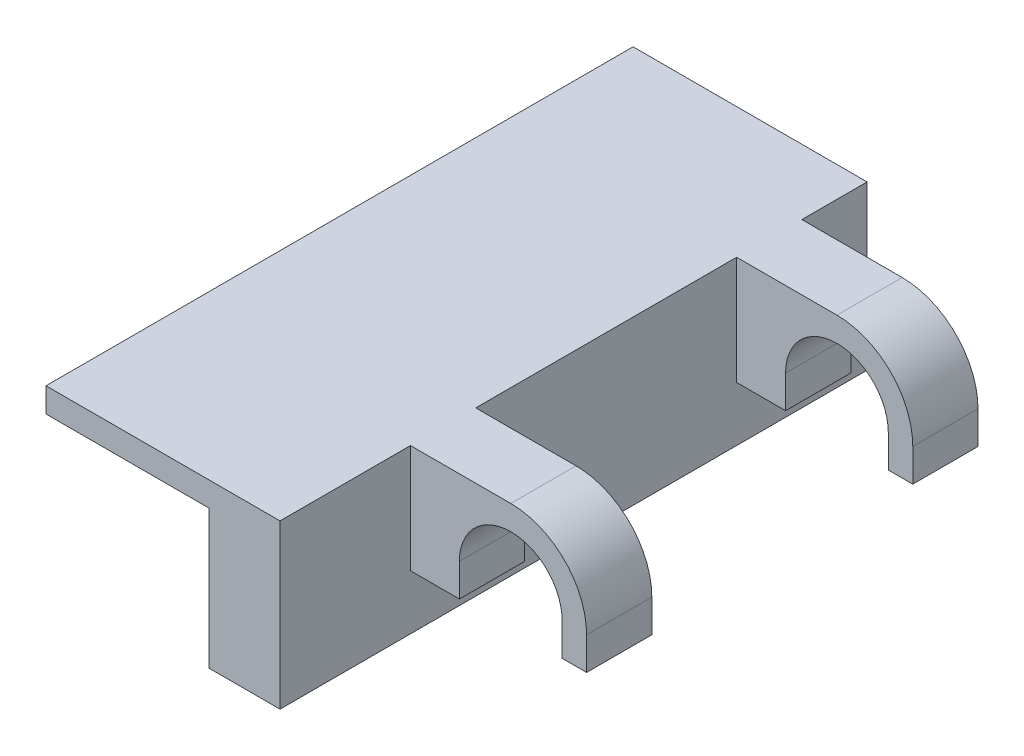
ISO-10303-21;
HEADER;
FILE_DESCRIPTION(('STEP AP214'),'2;1');
FILE_NAME('part.step','',(''),(''),'','','');
FILE_SCHEMA(('AUTOMOTIVE_DESIGN { 1 0 10303 214 1 1 1 1 }'));
ENDSEC;
DATA;
#1=APPLICATION_CONTEXT('core data for automotive mechanical design processes');
#2=APPLICATION_PROTOCOL_DEFINITION('international standard','automotive_design',2000,#1);
#3=PRODUCT_CONTEXT('',#1,'mechanical');
#4=PRODUCT('Part','Part','',(#3));
#5=PRODUCT_RELATED_PRODUCT_CATEGORY('part','',(#4));
#6=PRODUCT_DEFINITION_FORMATION('','',#4);
#7=PRODUCT_DEFINITION_CONTEXT('part definition',#1,'design');
#8=PRODUCT_DEFINITION('design','',#6,#7);
#9=PRODUCT_DEFINITION_SHAPE('','',#8);
#10=(LENGTH_UNIT() NAMED_UNIT(*) SI_UNIT(.MILLI.,.METRE.));
#11=(NAMED_UNIT(*) PLANE_ANGLE_UNIT() SI_UNIT($,.RADIAN.));
#12=(NAMED_UNIT(*) SI_UNIT($,.STERADIAN.) SOLID_ANGLE_UNIT());
#13=UNCERTAINTY_MEASURE_WITH_UNIT(LENGTH_MEASURE(1.E-05),#10,'distance_accuracy_value','');
#14=(GEOMETRIC_REPRESENTATION_CONTEXT(3) GLOBAL_UNCERTAINTY_ASSIGNED_CONTEXT((#13)) GLOBAL_UNIT_ASSIGNED_CONTEXT((#10,
#11,#12)) REPRESENTATION_CONTEXT('',''));
#15=CARTESIAN_POINT('',(0.,0.,0.));
#16=DIRECTION('',(0.,0.,1.));
#17=DIRECTION('',(1.,0.,0.));
#18=AXIS2_PLACEMENT_3D('',#15,#16,#17);
#19=CARTESIAN_POINT('',(191.85,-2.,18.));
#20=DIRECTION('',(0.,1.,0.));
#21=DIRECTION('',(-1.,0.,0.));
#22=AXIS2_PLACEMENT_3D('',#19,#20,#21);
#23=PLANE('',#22);
#24=DIRECTION('',(0.,0.,-1.));
#25=VECTOR('',#24,1.);
#26=CARTESIAN_POINT('',(191.85,-2.,18.));
#27=LINE('',#26,#25);
#28=CARTESIAN_POINT('',(191.85,-2.,10.));
#29=VERTEX_POINT('',#28);
#30=CARTESIAN_POINT('',(191.85,-2.,6.));
#31=VERTEX_POINT('',#30);
#32=EDGE_CURVE('E259',#29,#31,#27,.T.);
#33=ORIENTED_EDGE('',*,*,#32,.F.);
#34=DIRECTION('',(-1.,0.,0.));
#35=VECTOR('',#34,1.);
#36=CARTESIAN_POINT('',(191.85,-2.,10.));
#37=LINE('',#36,#35);
#38=CARTESIAN_POINT('',(188.85,-1.99999999999997,10.));
#39=VERTEX_POINT('',#38);
#40=EDGE_CURVE('E219',#29,#39,#37,.T.);
#41=ORIENTED_EDGE('',*,*,#40,.T.);
#42=DIRECTION('',(0.,0.,-1.));
#43=VECTOR('',#42,1.);
#44=CARTESIAN_POINT('',(188.85,-1.99999999999995,18.));
#45=LINE('',#44,#43);
#46=CARTESIAN_POINT('',(188.85,-1.99999999999997,6.));
#47=VERTEX_POINT('',#46);
#48=EDGE_CURVE('E262',#39,#47,#45,.T.);
#49=ORIENTED_EDGE('',*,*,#48,.T.);
#50=DIRECTION('',(1.,0.,0.));
#51=VECTOR('',#50,1.);
#52=CARTESIAN_POINT('',(191.85,-2.,6.));
#53=LINE('',#52,#51);
#54=EDGE_CURVE('E270',#47,#31,#53,.T.);
#55=ORIENTED_EDGE('',*,*,#54,.T.);
#56=EDGE_LOOP('',(#33,#41,#49,#55));
#57=FACE_BOUND('',#56,.T.);
#58=ADVANCED_FACE('F35',(#57),#23,.F.);
#59=CARTESIAN_POINT('',(191.85,0.,18.));
#60=DIRECTION('',(-1.,0.,0.));
#61=DIRECTION('',(0.,0.,1.));
#62=AXIS2_PLACEMENT_3D('',#59,#60,#61);
#63=PLANE('',#62);
#64=DIRECTION('',(0.,0.,-1.));
#65=VECTOR('',#64,1.);
#66=CARTESIAN_POINT('',(191.85,0.,18.));
#67=LINE('',#66,#65);
#68=CARTESIAN_POINT('',(191.85,0.,10.));
#69=VERTEX_POINT('',#68);
#70=CARTESIAN_POINT('',(191.85,0.,6.));
#71=VERTEX_POINT('',#70);
#72=EDGE_CURVE('E255',#69,#71,#67,.T.);
#73=ORIENTED_EDGE('',*,*,#72,.F.);
#74=DIRECTION('',(0.,-1.,0.));
#75=VECTOR('',#74,1.);
#76=CARTESIAN_POINT('',(191.85,0.,10.));
#77=LINE('',#76,#75);
#78=EDGE_CURVE('E224',#69,#29,#77,.T.);
#79=ORIENTED_EDGE('',*,*,#78,.T.);
#80=ORIENTED_EDGE('',*,*,#32,.T.);
#81=DIRECTION('',(0.,1.,0.));
#82=VECTOR('',#81,1.);
#83=CARTESIAN_POINT('',(191.85,0.,6.));
#84=LINE('',#83,#82);
#85=EDGE_CURVE('E346',#31,#71,#84,.T.);
#86=ORIENTED_EDGE('',*,*,#85,.T.);
#87=EDGE_LOOP('',(#73,#79,#80,#86));
#88=FACE_BOUND('',#87,.T.);
#89=ADVANCED_FACE('F443',(#88),#63,.F.);
#90=CARTESIAN_POINT('',(195.,0.,18.));
#91=DIRECTION('',(0.,0.,-1.));
#92=DIRECTION('',(-1.,0.,0.));
#93=AXIS2_PLACEMENT_3D('',#90,#91,#92);
#94=CYLINDRICAL_SURFACE('',#93,3.14999999999996);
#95=DIRECTION('',(0.,0.,-1.));
#96=VECTOR('',#95,1.);
#97=CARTESIAN_POINT('',(198.15,0.,18.));
#98=LINE('',#97,#96);
#99=CARTESIAN_POINT('',(198.15,0.,10.));
#100=VERTEX_POINT('',#99);
#101=CARTESIAN_POINT('',(198.15,0.,6.));
#102=VERTEX_POINT('',#101);
#103=EDGE_CURVE('E251',#100,#102,#98,.T.);
#104=ORIENTED_EDGE('',*,*,#103,.F.);
#105=CARTESIAN_POINT('',(195.,0.,10.));
#106=DIRECTION('',(0.,0.,-1.));
#107=DIRECTION('',(-1.,0.,0.));
#108=AXIS2_PLACEMENT_3D('',#105,#106,#107);
#109=CIRCLE('',#108,3.14999999999996);
#110=EDGE_CURVE('E359',#100,#69,#109,.F.);
#111=ORIENTED_EDGE('',*,*,#110,.T.);
#112=ORIENTED_EDGE('',*,*,#72,.T.);
#113=CARTESIAN_POINT('',(195.,0.,6.));
#114=DIRECTION('',(0.,0.,1.));
#115=DIRECTION('',(1.,0.,0.));
#116=AXIS2_PLACEMENT_3D('',#113,#114,#115);
#117=CIRCLE('',#116,3.14999999999996);
#118=EDGE_CURVE('E343',#71,#102,#117,.F.);
#119=ORIENTED_EDGE('',*,*,#118,.T.);
#120=EDGE_LOOP('',(#104,#111,#112,#119));
#121=FACE_BOUND('',#120,.T.);
#122=ADVANCED_FACE('F448',(#121),#94,.F.);
#123=CARTESIAN_POINT('',(198.15,0.,18.));
#124=DIRECTION('',(1.,0.,0.));
#125=DIRECTION('',(0.,1.,0.));
#126=AXIS2_PLACEMENT_3D('',#123,#124,#125);
#127=PLANE('',#126);
#128=DIRECTION('',(0.,0.,-1.));
#129=VECTOR('',#128,1.);
#130=CARTESIAN_POINT('',(198.15,-2.,18.));
#131=LINE('',#130,#129);
#132=CARTESIAN_POINT('',(198.15,-2.,10.));
#133=VERTEX_POINT('',#132);
#134=CARTESIAN_POINT('',(198.15,-2.,6.));
#135=VERTEX_POINT('',#134);
#136=EDGE_CURVE('E247',#133,#135,#131,.T.);
#137=ORIENTED_EDGE('',*,*,#136,.F.);
#138=DIRECTION('',(0.,1.,0.));
#139=VECTOR('',#138,1.);
#140=CARTESIAN_POINT('',(198.15,0.,10.));
#141=LINE('',#140,#139);
#142=EDGE_CURVE('E356',#133,#100,#141,.T.);
#143=ORIENTED_EDGE('',*,*,#142,.T.);
#144=ORIENTED_EDGE('',*,*,#103,.T.);
#145=DIRECTION('',(0.,-1.,0.));
#146=VECTOR('',#145,1.);
#147=CARTESIAN_POINT('',(198.15,0.,6.));
#148=LINE('',#147,#146);
#149=EDGE_CURVE('E340',#102,#135,#148,.T.);
#150=ORIENTED_EDGE('',*,*,#149,.T.);
#151=EDGE_LOOP('',(#137,#143,#144,#150));
#152=FACE_BOUND('',#151,.T.);
#153=ADVANCED_FACE('F486',(#152),#127,.F.);
#154=CARTESIAN_POINT('',(198.15,-2.,18.));
#155=DIRECTION('',(0.,1.,0.));
#156=DIRECTION('',(-1.,0.,0.));
#157=AXIS2_PLACEMENT_3D('',#154,#155,#156);
#158=PLANE('',#157);
#159=DIRECTION('',(0.,0.,-1.));
#160=VECTOR('',#159,1.);
#161=CARTESIAN_POINT('',(199.65,-2.,18.));
#162=LINE('',#161,#160);
#163=CARTESIAN_POINT('',(199.65,-2.,10.));
#164=VERTEX_POINT('',#163);
#165=CARTESIAN_POINT('',(199.65,-2.,6.));
#166=VERTEX_POINT('',#165);
#167=EDGE_CURVE('E243',#164,#166,#162,.T.);
#168=ORIENTED_EDGE('',*,*,#167,.F.);
#169=DIRECTION('',(-1.,0.,0.));
#170=VECTOR('',#169,1.);
#171=CARTESIAN_POINT('',(198.15,-2.,10.));
#172=LINE('',#171,#170);
#173=EDGE_CURVE('E353',#164,#133,#172,.T.);
#174=ORIENTED_EDGE('',*,*,#173,.T.);
#175=ORIENTED_EDGE('',*,*,#136,.T.);
#176=DIRECTION('',(1.,0.,0.));
#177=VECTOR('',#176,1.);
#178=CARTESIAN_POINT('',(198.15,-2.,6.));
#179=LINE('',#178,#177);
#180=EDGE_CURVE('E337',#135,#166,#179,.T.);
#181=ORIENTED_EDGE('',*,*,#180,.T.);
#182=EDGE_LOOP('',(#168,#174,#175,#181));
#183=FACE_BOUND('',#182,.T.);
#184=ADVANCED_FACE('F469',(#183),#158,.F.);
#185=CARTESIAN_POINT('',(199.65,-2.,18.));
#186=DIRECTION('',(-1.,0.,0.));
#187=DIRECTION('',(0.,-1.,0.));
#188=AXIS2_PLACEMENT_3D('',#185,#186,#187);
#189=PLANE('',#188);
#190=DIRECTION('',(0.,0.,-1.));
#191=VECTOR('',#190,1.);
#192=CARTESIAN_POINT('',(199.65,0.,18.));
#193=LINE('',#192,#191);
#194=CARTESIAN_POINT('',(199.65,0.,10.));
#195=VERTEX_POINT('',#194);
#196=CARTESIAN_POINT('',(199.65,0.,6.));
#197=VERTEX_POINT('',#196);
#198=EDGE_CURVE('E239',#195,#197,#193,.T.);
#199=ORIENTED_EDGE('',*,*,#198,.F.);
#200=DIRECTION('',(0.,-1.,0.));
#201=VECTOR('',#200,1.);
#202=CARTESIAN_POINT('',(199.65,4.65000000000001,10.));
#203=LINE('',#202,#201);
#204=EDGE_CURVE('E303',#195,#164,#203,.T.);
#205=ORIENTED_EDGE('',*,*,#204,.T.);
#206=ORIENTED_EDGE('',*,*,#167,.T.);
#207=DIRECTION('',(0.,-1.,0.));
#208=VECTOR('',#207,1.);
#209=CARTESIAN_POINT('',(199.65,4.65000000000001,6.));
#210=LINE('',#209,#208);
#211=EDGE_CURVE('E284',#197,#166,#210,.T.);
#212=ORIENTED_EDGE('',*,*,#211,.F.);
#213=EDGE_LOOP('',(#199,#205,#206,#212));
#214=FACE_BOUND('',#213,.T.);
#215=ADVANCED_FACE('F463',(#214),#189,.F.);
#216=CARTESIAN_POINT('',(195.,0.,18.));
#217=DIRECTION('',(0.,0.,-1.));
#218=DIRECTION('',(-1.,0.,0.));
#219=AXIS2_PLACEMENT_3D('',#216,#217,#218);
#220=CYLINDRICAL_SURFACE('',#219,4.64999999999994);
#221=DIRECTION('',(0.,0.,-1.));
#222=VECTOR('',#221,1.);
#223=CARTESIAN_POINT('',(195.,4.64999999999999,18.));
#224=LINE('',#223,#222);
#225=CARTESIAN_POINT('',(195.,4.65000000000001,10.));
#226=VERTEX_POINT('',#225);
#227=CARTESIAN_POINT('',(195.,4.65000000000001,6.));
#228=VERTEX_POINT('',#227);
#229=EDGE_CURVE('E235',#226,#228,#224,.T.);
#230=ORIENTED_EDGE('',*,*,#229,.F.);
#231=CARTESIAN_POINT('',(195.,0.,10.));
#232=DIRECTION('',(0.,0.,-1.));
#233=DIRECTION('',(-1.,0.,0.));
#234=AXIS2_PLACEMENT_3D('',#231,#232,#233);
#235=CIRCLE('',#234,4.64999999999994);
#236=EDGE_CURVE('E350',#226,#195,#235,.T.);
#237=ORIENTED_EDGE('',*,*,#236,.T.);
#238=ORIENTED_EDGE('',*,*,#198,.T.);
#239=CARTESIAN_POINT('',(195.,0.,6.));
#240=DIRECTION('',(0.,0.,1.));
#241=DIRECTION('',(1.,0.,0.));
#242=AXIS2_PLACEMENT_3D('',#239,#240,#241);
#243=CIRCLE('',#242,4.64999999999994);
#244=EDGE_CURVE('E334',#197,#228,#243,.T.);
#245=ORIENTED_EDGE('',*,*,#244,.T.);
#246=EDGE_LOOP('',(#230,#237,#238,#245));
#247=FACE_BOUND('',#246,.T.);
#248=ADVANCED_FACE('F459',(#247),#220,.T.);
#249=CARTESIAN_POINT('',(-188.85,-5.35000000000001,18.));
#250=DIRECTION('',(0.,1.,0.));
#251=DIRECTION('',(-1.,0.,0.));
#252=AXIS2_PLACEMENT_3D('',#249,#250,#251);
#253=PLANE('',#252);
#254=DIRECTION('',(1.,0.,0.));
#255=VECTOR('',#254,1.);
#256=CARTESIAN_POINT('',(-188.85,-5.35000000000001,18.));
#257=LINE('',#256,#255);
#258=CARTESIAN_POINT('',(184.5,-5.35000000000001,18.));
#259=VERTEX_POINT('',#258);
#260=CARTESIAN_POINT('',(188.85,-5.34999999999997,18.));
#261=VERTEX_POINT('',#260);
#262=EDGE_CURVE('E212',#259,#261,#257,.T.);
#263=ORIENTED_EDGE('',*,*,#262,.F.);
#264=DIRECTION('',(0.,0.,1.));
#265=VECTOR('',#264,1.);
#266=CARTESIAN_POINT('',(184.5,-5.35000000000001,-18.));
#267=LINE('',#266,#265);
#268=CARTESIAN_POINT('',(184.5,-5.35000000000001,-18.));
#269=VERTEX_POINT('',#268);
#270=EDGE_CURVE('E200',#269,#259,#267,.T.);
#271=ORIENTED_EDGE('',*,*,#270,.F.);
#272=DIRECTION('',(1.,0.,0.));
#273=VECTOR('',#272,1.);
#274=CARTESIAN_POINT('',(-188.85,-5.35000000000001,-18.));
#275=LINE('',#274,#273);
#276=CARTESIAN_POINT('',(188.85,-5.34999999999997,-18.));
#277=VERTEX_POINT('',#276);
#278=EDGE_CURVE('E210',#269,#277,#275,.T.);
#279=ORIENTED_EDGE('',*,*,#278,.T.);
#280=DIRECTION('',(0.,0.,-1.));
#281=VECTOR('',#280,1.);
#282=CARTESIAN_POINT('',(188.85,-5.34999999999997,18.));
#283=LINE('',#282,#281);
#284=EDGE_CURVE('E43',#261,#277,#283,.T.);
#285=ORIENTED_EDGE('',*,*,#284,.F.);
#286=EDGE_LOOP('',(#263,#271,#279,#285));
#287=FACE_BOUND('',#286,.T.);
#288=ADVANCED_FACE('F37',(#287),#253,.F.);
#289=CARTESIAN_POINT('',(188.85,-1.99999999999995,18.));
#290=DIRECTION('',(-1.,0.,0.));
#291=DIRECTION('',(0.,0.,1.));
#292=AXIS2_PLACEMENT_3D('',#289,#290,#291);
#293=PLANE('',#292);
#294=CARTESIAN_POINT('',(188.85,-1.99999999999997,-10.));
#295=VERTEX_POINT('',#294);
#296=CARTESIAN_POINT('',(188.85,-1.99999999999997,-14.));
#297=VERTEX_POINT('',#296);
#298=EDGE_CURVE('E260',#295,#297,#45,.T.);
#299=ORIENTED_EDGE('',*,*,#298,.F.);
#300=DIRECTION('',(0.,-1.,0.));
#301=VECTOR('',#300,1.);
#302=CARTESIAN_POINT('',(188.85,4.65000000000001,-10.));
#303=LINE('',#302,#301);
#304=CARTESIAN_POINT('',(188.85,4.65000000000001,-10.));
#305=VERTEX_POINT('',#304);
#306=EDGE_CURVE('E297',#305,#295,#303,.T.);
#307=ORIENTED_EDGE('',*,*,#306,.F.);
#308=DIRECTION('',(0.,0.,-1.));
#309=VECTOR('',#308,1.);
#310=CARTESIAN_POINT('',(188.85,4.65000000000001,6.));
#311=LINE('',#310,#309);
#312=CARTESIAN_POINT('',(188.85,4.65000000000001,6.));
#313=VERTEX_POINT('',#312);
#314=EDGE_CURVE('E281',#313,#305,#311,.T.);
#315=ORIENTED_EDGE('',*,*,#314,.F.);
#316=DIRECTION('',(0.,-1.,0.));
#317=VECTOR('',#316,1.);
#318=CARTESIAN_POINT('',(188.85,4.65000000000001,6.));
#319=LINE('',#318,#317);
#320=EDGE_CURVE('E279',#313,#47,#319,.T.);
#321=ORIENTED_EDGE('',*,*,#320,.T.);
#322=ORIENTED_EDGE('',*,*,#48,.F.);
#323=DIRECTION('',(0.,-1.,0.));
#324=VECTOR('',#323,1.);
#325=CARTESIAN_POINT('',(188.85,4.65000000000001,10.));
#326=LINE('',#325,#324);
#327=CARTESIAN_POINT('',(188.85,4.65000000000001,10.));
#328=VERTEX_POINT('',#327);
#329=EDGE_CURVE('E276',#328,#39,#326,.T.);
#330=ORIENTED_EDGE('',*,*,#329,.F.);
#331=DIRECTION('',(0.,0.,-1.));
#332=VECTOR('',#331,1.);
#333=CARTESIAN_POINT('',(188.85,4.65000000000001,18.));
#334=LINE('',#333,#332);
#335=CARTESIAN_POINT('',(188.85,4.64999999999999,18.));
#336=VERTEX_POINT('',#335);
#337=EDGE_CURVE('E283',#336,#328,#334,.T.);
#338=ORIENTED_EDGE('',*,*,#337,.F.);
#339=DIRECTION('',(0.,1.,0.));
#340=VECTOR('',#339,1.);
#341=CARTESIAN_POINT('',(188.85,-1.99999999999995,18.));
#342=LINE('',#341,#340);
#343=EDGE_CURVE('E364',#261,#336,#342,.T.);
#344=ORIENTED_EDGE('',*,*,#343,.F.);
#345=ORIENTED_EDGE('',*,*,#284,.T.);
#346=DIRECTION('',(0.,1.,0.));
#347=VECTOR('',#346,1.);
#348=CARTESIAN_POINT('',(188.85,-1.99999999999995,-18.));
#349=LINE('',#348,#347);
#350=CARTESIAN_POINT('',(188.85,4.65000000000001,-18.));
#351=VERTEX_POINT('',#350);
#352=EDGE_CURVE('E218',#277,#351,#349,.T.);
#353=ORIENTED_EDGE('',*,*,#352,.T.);
#354=DIRECTION('',(0.,0.,-1.));
#355=VECTOR('',#354,1.);
#356=CARTESIAN_POINT('',(188.85,4.65000000000001,-14.));
#357=LINE('',#356,#355);
#358=CARTESIAN_POINT('',(188.85,4.65000000000001,-14.));
#359=VERTEX_POINT('',#358);
#360=EDGE_CURVE('E380',#359,#351,#357,.T.);
#361=ORIENTED_EDGE('',*,*,#360,.F.);
#362=DIRECTION('',(0.,-1.,0.));
#363=VECTOR('',#362,1.);
#364=CARTESIAN_POINT('',(188.85,4.65000000000001,-14.));
#365=LINE('',#364,#363);
#366=EDGE_CURVE('E393',#359,#297,#365,.T.);
#367=ORIENTED_EDGE('',*,*,#366,.T.);
#368=EDGE_LOOP('',(#299,#307,#315,#321,#322,#330,#338,#344,#345,#353,#361,#367));
#369=FACE_BOUND('',#368,.T.);
#370=ADVANCED_FACE('F274',(#369),#293,.F.);
#371=CARTESIAN_POINT('',(191.85,-2.,-10.));
#372=VERTEX_POINT('',#371);
#373=CARTESIAN_POINT('',(191.85,-2.,-14.));
#374=VERTEX_POINT('',#373);
#375=EDGE_CURVE('E256',#372,#374,#27,.T.);
#376=ORIENTED_EDGE('',*,*,#375,.F.);
#377=DIRECTION('',(-1.,0.,0.));
#378=VECTOR('',#377,1.);
#379=CARTESIAN_POINT('',(191.85,-2.,-10.));
#380=LINE('',#379,#378);
#381=EDGE_CURVE('E331',#372,#295,#380,.T.);
#382=ORIENTED_EDGE('',*,*,#381,.T.);
#383=ORIENTED_EDGE('',*,*,#298,.T.);
#384=DIRECTION('',(1.,0.,0.));
#385=VECTOR('',#384,1.);
#386=CARTESIAN_POINT('',(191.85,-2.,-14.));
#387=LINE('',#386,#385);
#388=EDGE_CURVE('E315',#297,#374,#387,.T.);
#389=ORIENTED_EDGE('',*,*,#388,.T.);
#390=EDGE_LOOP('',(#376,#382,#383,#389));
#391=FACE_BOUND('',#390,.T.);
#392=ADVANCED_FACE('F423',(#391),#23,.F.);
#393=CARTESIAN_POINT('',(191.85,0.,-10.));
#394=VERTEX_POINT('',#393);
#395=CARTESIAN_POINT('',(191.85,0.,-14.));
#396=VERTEX_POINT('',#395);
#397=EDGE_CURVE('E252',#394,#396,#67,.T.);
#398=ORIENTED_EDGE('',*,*,#397,.F.);
#399=DIRECTION('',(0.,-1.,0.));
#400=VECTOR('',#399,1.);
#401=CARTESIAN_POINT('',(191.85,0.,-10.));
#402=LINE('',#401,#400);
#403=EDGE_CURVE('E328',#394,#372,#402,.T.);
#404=ORIENTED_EDGE('',*,*,#403,.T.);
#405=ORIENTED_EDGE('',*,*,#375,.T.);
#406=DIRECTION('',(0.,1.,0.));
#407=VECTOR('',#406,1.);
#408=CARTESIAN_POINT('',(191.85,0.,-14.));
#409=LINE('',#408,#407);
#410=EDGE_CURVE('E312',#374,#396,#409,.T.);
#411=ORIENTED_EDGE('',*,*,#410,.T.);
#412=EDGE_LOOP('',(#398,#404,#405,#411));
#413=FACE_BOUND('',#412,.T.);
#414=ADVANCED_FACE('F420',(#413),#63,.F.);
#415=CARTESIAN_POINT('',(198.15,0.,-10.));
#416=VERTEX_POINT('',#415);
#417=CARTESIAN_POINT('',(198.15,0.,-14.));
#418=VERTEX_POINT('',#417);
#419=EDGE_CURVE('E248',#416,#418,#98,.T.);
#420=ORIENTED_EDGE('',*,*,#419,.F.);
#421=CARTESIAN_POINT('',(195.,0.,-10.));
#422=DIRECTION('',(0.,0.,-1.));
#423=DIRECTION('',(-1.,0.,0.));
#424=AXIS2_PLACEMENT_3D('',#421,#422,#423);
#425=CIRCLE('',#424,3.14999999999996);
#426=EDGE_CURVE('E325',#416,#394,#425,.F.);
#427=ORIENTED_EDGE('',*,*,#426,.T.);
#428=ORIENTED_EDGE('',*,*,#397,.T.);
#429=CARTESIAN_POINT('',(195.,0.,-14.));
#430=DIRECTION('',(0.,0.,1.));
#431=DIRECTION('',(1.,0.,0.));
#432=AXIS2_PLACEMENT_3D('',#429,#430,#431);
#433=CIRCLE('',#432,3.14999999999996);
#434=EDGE_CURVE('E309',#396,#418,#433,.F.);
#435=ORIENTED_EDGE('',*,*,#434,.T.);
#436=EDGE_LOOP('',(#420,#427,#428,#435));
#437=FACE_BOUND('',#436,.T.);
#438=ADVANCED_FACE('F417',(#437),#94,.F.);
#439=CARTESIAN_POINT('',(198.15,-2.,-10.));
#440=VERTEX_POINT('',#439);
#441=CARTESIAN_POINT('',(198.15,-2.,-14.));
#442=VERTEX_POINT('',#441);
#443=EDGE_CURVE('E244',#440,#442,#131,.T.);
#444=ORIENTED_EDGE('',*,*,#443,.F.);
#445=DIRECTION('',(0.,1.,0.));
#446=VECTOR('',#445,1.);
#447=CARTESIAN_POINT('',(198.15,0.,-10.));
#448=LINE('',#447,#446);
#449=EDGE_CURVE('E322',#440,#416,#448,.T.);
#450=ORIENTED_EDGE('',*,*,#449,.T.);
#451=ORIENTED_EDGE('',*,*,#419,.T.);
#452=DIRECTION('',(0.,-1.,0.));
#453=VECTOR('',#452,1.);
#454=CARTESIAN_POINT('',(198.15,0.,-14.));
#455=LINE('',#454,#453);
#456=EDGE_CURVE('E306',#418,#442,#455,.T.);
#457=ORIENTED_EDGE('',*,*,#456,.T.);
#458=EDGE_LOOP('',(#444,#450,#451,#457));
#459=FACE_BOUND('',#458,.T.);
#460=ADVANCED_FACE('F414',(#459),#127,.F.);
#461=CARTESIAN_POINT('',(199.65,-2.,-10.));
#462=VERTEX_POINT('',#461);
#463=CARTESIAN_POINT('',(199.65,-2.,-14.));
#464=VERTEX_POINT('',#463);
#465=EDGE_CURVE('E240',#462,#464,#162,.T.);
#466=ORIENTED_EDGE('',*,*,#465,.F.);
#467=DIRECTION('',(-1.,0.,0.));
#468=VECTOR('',#467,1.);
#469=CARTESIAN_POINT('',(198.15,-2.,-10.));
#470=LINE('',#469,#468);
#471=EDGE_CURVE('E319',#462,#440,#470,.T.);
#472=ORIENTED_EDGE('',*,*,#471,.T.);
#473=ORIENTED_EDGE('',*,*,#443,.T.);
#474=DIRECTION('',(1.,0.,0.));
#475=VECTOR('',#474,1.);
#476=CARTESIAN_POINT('',(198.15,-2.,-14.));
#477=LINE('',#476,#475);
#478=EDGE_CURVE('E302',#442,#464,#477,.T.);
#479=ORIENTED_EDGE('',*,*,#478,.T.);
#480=EDGE_LOOP('',(#466,#472,#473,#479));
#481=FACE_BOUND('',#480,.T.);
#482=ADVANCED_FACE('F411',(#481),#158,.F.);
#483=CARTESIAN_POINT('',(199.65,0.,-10.));
#484=VERTEX_POINT('',#483);
#485=CARTESIAN_POINT('',(199.65,0.,-14.));
#486=VERTEX_POINT('',#485);
#487=EDGE_CURVE('E236',#484,#486,#193,.T.);
#488=ORIENTED_EDGE('',*,*,#487,.F.);
#489=DIRECTION('',(0.,-1.,0.));
#490=VECTOR('',#489,1.);
#491=CARTESIAN_POINT('',(199.65,4.65000000000001,-10.));
#492=LINE('',#491,#490);
#493=EDGE_CURVE('E289',#484,#462,#492,.T.);
#494=ORIENTED_EDGE('',*,*,#493,.T.);
#495=ORIENTED_EDGE('',*,*,#465,.T.);
#496=DIRECTION('',(0.,-1.,0.));
#497=VECTOR('',#496,1.);
#498=CARTESIAN_POINT('',(199.65,4.65000000000001,-14.));
#499=LINE('',#498,#497);
#500=EDGE_CURVE('E392',#486,#464,#499,.T.);
#501=ORIENTED_EDGE('',*,*,#500,.F.);
#502=EDGE_LOOP('',(#488,#494,#495,#501));
#503=FACE_BOUND('',#502,.T.);
#504=ADVANCED_FACE('F408',(#503),#189,.F.);
#505=CARTESIAN_POINT('',(195.,4.64999999999999,-10.));
#506=VERTEX_POINT('',#505);
#507=CARTESIAN_POINT('',(195.,4.65000000000001,-14.));
#508=VERTEX_POINT('',#507);
#509=EDGE_CURVE('E232',#506,#508,#224,.T.);
#510=ORIENTED_EDGE('',*,*,#509,.F.);
#511=CARTESIAN_POINT('',(195.,0.,-10.));
#512=DIRECTION('',(0.,0.,-1.));
#513=DIRECTION('',(-1.,0.,0.));
#514=AXIS2_PLACEMENT_3D('',#511,#512,#513);
#515=CIRCLE('',#514,4.64999999999994);
#516=EDGE_CURVE('E58',#506,#484,#515,.T.);
#517=ORIENTED_EDGE('',*,*,#516,.T.);
#518=ORIENTED_EDGE('',*,*,#487,.T.);
#519=CARTESIAN_POINT('',(195.,0.,-14.));
#520=DIRECTION('',(0.,0.,1.));
#521=DIRECTION('',(1.,0.,0.));
#522=AXIS2_PLACEMENT_3D('',#519,#520,#521);
#523=CIRCLE('',#522,4.64999999999994);
#524=EDGE_CURVE('E299',#486,#508,#523,.T.);
#525=ORIENTED_EDGE('',*,*,#524,.T.);
#526=EDGE_LOOP('',(#510,#517,#518,#525));
#527=FACE_BOUND('',#526,.T.);
#528=ADVANCED_FACE('F402',(#527),#220,.T.);
#529=CARTESIAN_POINT('',(-195.,4.64999999999999,18.));
#530=DIRECTION('',(0.,-1.,0.));
#531=DIRECTION('',(0.,0.,-1.));
#532=AXIS2_PLACEMENT_3D('',#529,#530,#531);
#533=PLANE('',#532);
#534=DIRECTION('',(-1.,0.,0.));
#535=VECTOR('',#534,1.);
#536=CARTESIAN_POINT('',(-195.,4.64999999999999,-18.));
#537=LINE('',#536,#535);
#538=CARTESIAN_POINT('',(174.5,4.64999999999999,-18.));
#539=VERTEX_POINT('',#538);
#540=EDGE_CURVE('E221',#351,#539,#537,.T.);
#541=ORIENTED_EDGE('',*,*,#540,.T.);
#542=DIRECTION('',(0.,0.,1.));
#543=VECTOR('',#542,1.);
#544=CARTESIAN_POINT('',(174.5,4.64999999999999,-18.));
#545=LINE('',#544,#543);
#546=CARTESIAN_POINT('',(174.5,4.64999999999999,18.));
#547=VERTEX_POINT('',#546);
#548=EDGE_CURVE('E375',#539,#547,#545,.T.);
#549=ORIENTED_EDGE('',*,*,#548,.T.);
#550=DIRECTION('',(-1.,0.,0.));
#551=VECTOR('',#550,1.);
#552=CARTESIAN_POINT('',(-195.,4.64999999999999,18.));
#553=LINE('',#552,#551);
#554=EDGE_CURVE('E227',#336,#547,#553,.T.);
#555=ORIENTED_EDGE('',*,*,#554,.F.);
#556=ORIENTED_EDGE('',*,*,#337,.T.);
#557=DIRECTION('',(1.,0.,0.));
#558=VECTOR('',#557,1.);
#559=CARTESIAN_POINT('',(188.85,4.65000000000001,10.));
#560=LINE('',#559,#558);
#561=EDGE_CURVE('E287',#328,#226,#560,.T.);
#562=ORIENTED_EDGE('',*,*,#561,.T.);
#563=ORIENTED_EDGE('',*,*,#229,.T.);
#564=DIRECTION('',(-1.,0.,0.));
#565=VECTOR('',#564,1.);
#566=CARTESIAN_POINT('',(-195.,4.64999999999999,6.));
#567=LINE('',#566,#565);
#568=EDGE_CURVE('E11',#228,#313,#567,.T.);
#569=ORIENTED_EDGE('',*,*,#568,.T.);
#570=ORIENTED_EDGE('',*,*,#314,.T.);
#571=DIRECTION('',(1.,0.,0.));
#572=VECTOR('',#571,1.);
#573=CARTESIAN_POINT('',(188.85,4.65000000000001,-10.));
#574=LINE('',#573,#572);
#575=EDGE_CURVE('E292',#305,#506,#574,.T.);
#576=ORIENTED_EDGE('',*,*,#575,.T.);
#577=ORIENTED_EDGE('',*,*,#509,.T.);
#578=DIRECTION('',(-1.,0.,0.));
#579=VECTOR('',#578,1.);
#580=CARTESIAN_POINT('',(188.85,4.65000000000001,-14.));
#581=LINE('',#580,#579);
#582=EDGE_CURVE('E383',#508,#359,#581,.T.);
#583=ORIENTED_EDGE('',*,*,#582,.T.);
#584=ORIENTED_EDGE('',*,*,#360,.T.);
#585=EDGE_LOOP('',(#541,#549,#555,#556,#562,#563,#569,#570,#576,#577,#583,#584));
#586=FACE_BOUND('',#585,.T.);
#587=ADVANCED_FACE('F373',(#586),#533,.F.);
#588=CARTESIAN_POINT('',(195.,0.,18.));
#589=DIRECTION('',(0.,0.,1.));
#590=DIRECTION('',(1.,0.,0.));
#591=AXIS2_PLACEMENT_3D('',#588,#589,#590);
#592=PLANE('',#591);
#593=DIRECTION('',(0.,1.,0.));
#594=VECTOR('',#593,1.);
#595=CARTESIAN_POINT('',(174.5,4.64999999999999,18.));
#596=LINE('',#595,#594);
#597=CARTESIAN_POINT('',(174.5,3.15000000000003,18.));
#598=VERTEX_POINT('',#597);
#599=EDGE_CURVE('E205',#598,#547,#596,.T.);
#600=ORIENTED_EDGE('',*,*,#599,.F.);
#601=DIRECTION('',(-1.,0.,0.));
#602=VECTOR('',#601,1.);
#603=CARTESIAN_POINT('',(174.5,3.15000000000003,18.));
#604=LINE('',#603,#602);
#605=CARTESIAN_POINT('',(184.5,3.15000000000003,18.));
#606=VERTEX_POINT('',#605);
#607=EDGE_CURVE('E429',#606,#598,#604,.T.);
#608=ORIENTED_EDGE('',*,*,#607,.F.);
#609=DIRECTION('',(0.,1.,0.));
#610=VECTOR('',#609,1.);
#611=CARTESIAN_POINT('',(184.5,3.15000000000003,18.));
#612=LINE('',#611,#610);
#613=EDGE_CURVE('E428',#259,#606,#612,.T.);
#614=ORIENTED_EDGE('',*,*,#613,.F.);
#615=ORIENTED_EDGE('',*,*,#262,.T.);
#616=ORIENTED_EDGE('',*,*,#343,.T.);
#617=ORIENTED_EDGE('',*,*,#554,.T.);
#618=EDGE_LOOP('',(#600,#608,#614,#615,#616,#617));
#619=FACE_BOUND('',#618,.T.);
#620=ADVANCED_FACE('F369',(#619),#592,.T.);
#621=CARTESIAN_POINT('',(195.,0.,-18.));
#622=DIRECTION('',(0.,0.,1.));
#623=DIRECTION('',(1.,0.,0.));
#624=AXIS2_PLACEMENT_3D('',#621,#622,#623);
#625=PLANE('',#624);
#626=DIRECTION('',(-1.,0.,0.));
#627=VECTOR('',#626,1.);
#628=CARTESIAN_POINT('',(174.5,3.15000000000003,-18.));
#629=LINE('',#628,#627);
#630=CARTESIAN_POINT('',(184.5,3.15000000000003,-18.));
#631=VERTEX_POINT('',#630);
#632=CARTESIAN_POINT('',(174.5,3.15000000000003,-18.));
#633=VERTEX_POINT('',#632);
#634=EDGE_CURVE('E50',#631,#633,#629,.T.);
#635=ORIENTED_EDGE('',*,*,#634,.T.);
#636=DIRECTION('',(0.,1.,0.));
#637=VECTOR('',#636,1.);
#638=CARTESIAN_POINT('',(174.5,4.64999999999999,-18.));
#639=LINE('',#638,#637);
#640=EDGE_CURVE('E213',#633,#539,#639,.T.);
#641=ORIENTED_EDGE('',*,*,#640,.T.);
#642=ORIENTED_EDGE('',*,*,#540,.F.);
#643=ORIENTED_EDGE('',*,*,#352,.F.);
#644=ORIENTED_EDGE('',*,*,#278,.F.);
#645=DIRECTION('',(0.,1.,0.));
#646=VECTOR('',#645,1.);
#647=CARTESIAN_POINT('',(184.5,3.15000000000003,-18.));
#648=LINE('',#647,#646);
#649=EDGE_CURVE('E196',#269,#631,#648,.T.);
#650=ORIENTED_EDGE('',*,*,#649,.T.);
#651=EDGE_LOOP('',(#635,#641,#642,#643,#644,#650));
#652=FACE_BOUND('',#651,.T.);
#653=ADVANCED_FACE('F216',(#652),#625,.F.);
#654=CARTESIAN_POINT('',(188.85,4.65000000000001,-14.));
#655=DIRECTION('',(0.,0.,1.));
#656=DIRECTION('',(1.,0.,0.));
#657=AXIS2_PLACEMENT_3D('',#654,#655,#656);
#658=PLANE('',#657);
#659=ORIENTED_EDGE('',*,*,#366,.F.);
#660=ORIENTED_EDGE('',*,*,#582,.F.);
#661=ORIENTED_EDGE('',*,*,#524,.F.);
#662=ORIENTED_EDGE('',*,*,#500,.T.);
#663=ORIENTED_EDGE('',*,*,#478,.F.);
#664=ORIENTED_EDGE('',*,*,#456,.F.);
#665=ORIENTED_EDGE('',*,*,#434,.F.);
#666=ORIENTED_EDGE('',*,*,#410,.F.);
#667=ORIENTED_EDGE('',*,*,#388,.F.);
#668=EDGE_LOOP('',(#659,#660,#661,#662,#663,#664,#665,#666,#667));
#669=FACE_BOUND('',#668,.T.);
#670=ADVANCED_FACE('F406',(#669),#658,.F.);
#671=CARTESIAN_POINT('',(188.85,4.65000000000001,10.));
#672=DIRECTION('',(0.,0.,-1.));
#673=DIRECTION('',(-1.,0.,0.));
#674=AXIS2_PLACEMENT_3D('',#671,#672,#673);
#675=PLANE('',#674);
#676=ORIENTED_EDGE('',*,*,#78,.F.);
#677=ORIENTED_EDGE('',*,*,#110,.F.);
#678=ORIENTED_EDGE('',*,*,#142,.F.);
#679=ORIENTED_EDGE('',*,*,#173,.F.);
#680=ORIENTED_EDGE('',*,*,#204,.F.);
#681=ORIENTED_EDGE('',*,*,#236,.F.);
#682=ORIENTED_EDGE('',*,*,#561,.F.);
#683=ORIENTED_EDGE('',*,*,#329,.T.);
#684=ORIENTED_EDGE('',*,*,#40,.F.);
#685=EDGE_LOOP('',(#676,#677,#678,#679,#680,#681,#682,#683,#684));
#686=FACE_BOUND('',#685,.T.);
#687=ADVANCED_FACE('F503',(#686),#675,.F.);
#688=CARTESIAN_POINT('',(188.85,4.65000000000001,6.));
#689=DIRECTION('',(0.,0.,1.));
#690=DIRECTION('',(1.,0.,0.));
#691=AXIS2_PLACEMENT_3D('',#688,#689,#690);
#692=PLANE('',#691);
#693=ORIENTED_EDGE('',*,*,#320,.F.);
#694=ORIENTED_EDGE('',*,*,#568,.F.);
#695=ORIENTED_EDGE('',*,*,#244,.F.);
#696=ORIENTED_EDGE('',*,*,#211,.T.);
#697=ORIENTED_EDGE('',*,*,#180,.F.);
#698=ORIENTED_EDGE('',*,*,#149,.F.);
#699=ORIENTED_EDGE('',*,*,#118,.F.);
#700=ORIENTED_EDGE('',*,*,#85,.F.);
#701=ORIENTED_EDGE('',*,*,#54,.F.);
#702=EDGE_LOOP('',(#693,#694,#695,#696,#697,#698,#699,#700,#701));
#703=FACE_BOUND('',#702,.T.);
#704=ADVANCED_FACE('F511',(#703),#692,.F.);
#705=CARTESIAN_POINT('',(188.85,4.65000000000001,-10.));
#706=DIRECTION('',(0.,0.,-1.));
#707=DIRECTION('',(-1.,0.,0.));
#708=AXIS2_PLACEMENT_3D('',#705,#706,#707);
#709=PLANE('',#708);
#710=ORIENTED_EDGE('',*,*,#403,.F.);
#711=ORIENTED_EDGE('',*,*,#426,.F.);
#712=ORIENTED_EDGE('',*,*,#449,.F.);
#713=ORIENTED_EDGE('',*,*,#471,.F.);
#714=ORIENTED_EDGE('',*,*,#493,.F.);
#715=ORIENTED_EDGE('',*,*,#516,.F.);
#716=ORIENTED_EDGE('',*,*,#575,.F.);
#717=ORIENTED_EDGE('',*,*,#306,.T.);
#718=ORIENTED_EDGE('',*,*,#381,.F.);
#719=EDGE_LOOP('',(#710,#711,#712,#713,#714,#715,#716,#717,#718));
#720=FACE_BOUND('',#719,.T.);
#721=ADVANCED_FACE('F440',(#720),#709,.F.);
#722=CARTESIAN_POINT('',(174.5,4.64999999999999,-18.));
#723=DIRECTION('',(1.,0.,0.));
#724=DIRECTION('',(0.,0.,-1.));
#725=AXIS2_PLACEMENT_3D('',#722,#723,#724);
#726=PLANE('',#725);
#727=ORIENTED_EDGE('',*,*,#599,.T.);
#728=ORIENTED_EDGE('',*,*,#548,.F.);
#729=ORIENTED_EDGE('',*,*,#640,.F.);
#730=DIRECTION('',(0.,0.,1.));
#731=VECTOR('',#730,1.);
#732=CARTESIAN_POINT('',(174.5,3.15000000000003,-18.));
#733=LINE('',#732,#731);
#734=EDGE_CURVE('E381',#633,#598,#733,.T.);
#735=ORIENTED_EDGE('',*,*,#734,.T.);
#736=EDGE_LOOP('',(#727,#728,#729,#735));
#737=FACE_BOUND('',#736,.T.);
#738=ADVANCED_FACE('F431',(#737),#726,.F.);
#739=CARTESIAN_POINT('',(174.5,3.15000000000003,-18.));
#740=DIRECTION('',(0.,1.,0.));
#741=DIRECTION('',(-1.,0.,0.));
#742=AXIS2_PLACEMENT_3D('',#739,#740,#741);
#743=PLANE('',#742);
#744=ORIENTED_EDGE('',*,*,#607,.T.);
#745=ORIENTED_EDGE('',*,*,#734,.F.);
#746=ORIENTED_EDGE('',*,*,#634,.F.);
#747=DIRECTION('',(0.,0.,1.));
#748=VECTOR('',#747,1.);
#749=CARTESIAN_POINT('',(184.5,3.15000000000003,-18.));
#750=LINE('',#749,#748);
#751=EDGE_CURVE('E202',#631,#606,#750,.T.);
#752=ORIENTED_EDGE('',*,*,#751,.T.);
#753=EDGE_LOOP('',(#744,#745,#746,#752));
#754=FACE_BOUND('',#753,.T.);
#755=ADVANCED_FACE('F432',(#754),#743,.F.);
#756=CARTESIAN_POINT('',(184.5,3.15000000000003,-18.));
#757=DIRECTION('',(1.,0.,0.));
#758=DIRECTION('',(0.,0.,-1.));
#759=AXIS2_PLACEMENT_3D('',#756,#757,#758);
#760=PLANE('',#759);
#761=ORIENTED_EDGE('',*,*,#613,.T.);
#762=ORIENTED_EDGE('',*,*,#751,.F.);
#763=ORIENTED_EDGE('',*,*,#649,.F.);
#764=ORIENTED_EDGE('',*,*,#270,.T.);
#765=EDGE_LOOP('',(#761,#762,#763,#764));
#766=FACE_BOUND('',#765,.T.);
#767=ADVANCED_FACE('F199',(#766),#760,.F.);
#768=CLOSED_SHELL('',(#58,#89,#122,#153,#184,#215,#248,#288,#370,#392,#414,#438,#460,#482,#504,
#528,#587,#620,#653,#670,#687,#704,#721,#738,#755,#767));
#769=MANIFOLD_SOLID_BREP('B2',#768);
#770=ADVANCED_BREP_SHAPE_REPRESENTATION('',(#18,#769),#14);
#771=SHAPE_DEFINITION_REPRESENTATION(#9,#770);
ENDSEC;
END-ISO-10303-21;
